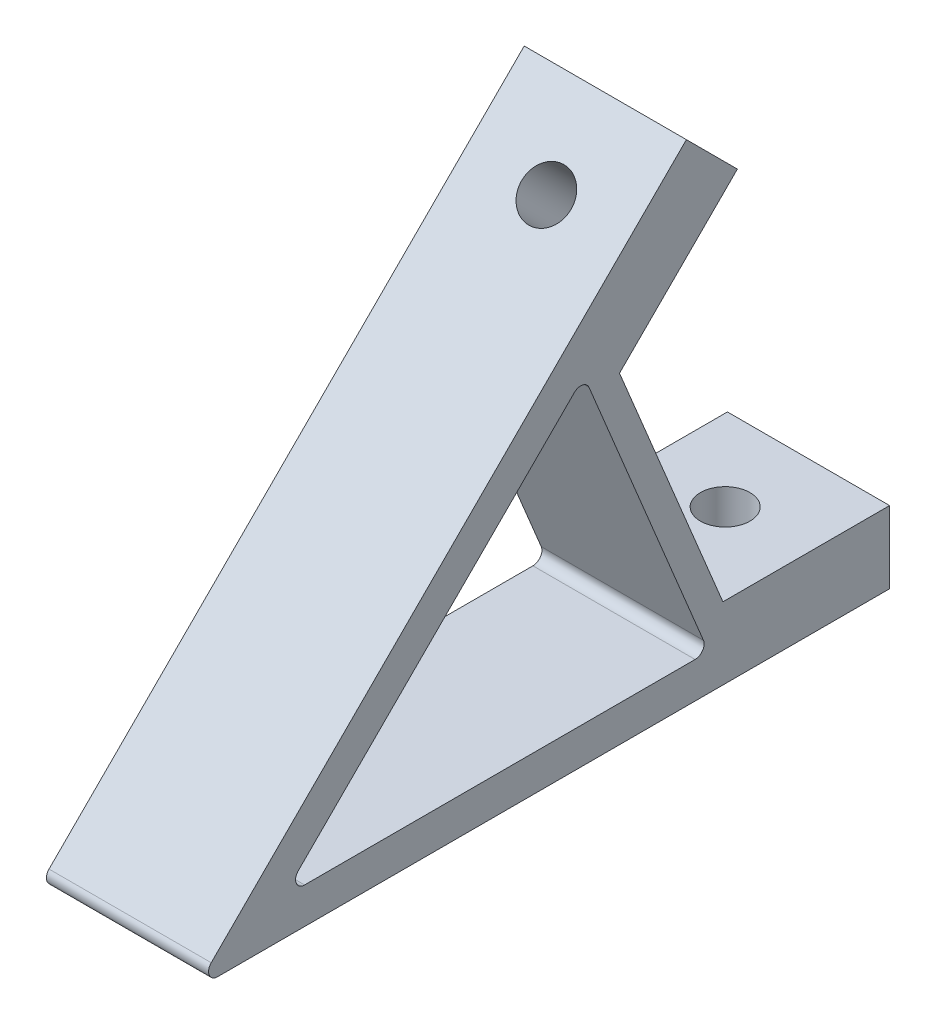
ISO-10303-21;
HEADER;
FILE_DESCRIPTION(('STEP AP214'),'2;1');
FILE_NAME('part.step','',(''),(''),'','','');
FILE_SCHEMA(('AUTOMOTIVE_DESIGN { 1 0 10303 214 1 1 1 1 }'));
ENDSEC;
DATA;
#1=APPLICATION_CONTEXT('core data for automotive mechanical design processes');
#2=APPLICATION_PROTOCOL_DEFINITION('international standard','automotive_design',2000,#1);
#3=PRODUCT_CONTEXT('',#1,'mechanical');
#4=PRODUCT('Part','Part','',(#3));
#5=PRODUCT_RELATED_PRODUCT_CATEGORY('part','',(#4));
#6=PRODUCT_DEFINITION_FORMATION('','',#4);
#7=PRODUCT_DEFINITION_CONTEXT('part definition',#1,'design');
#8=PRODUCT_DEFINITION('design','',#6,#7);
#9=PRODUCT_DEFINITION_SHAPE('','',#8);
#10=(LENGTH_UNIT() NAMED_UNIT(*) SI_UNIT(.MILLI.,.METRE.));
#11=(NAMED_UNIT(*) PLANE_ANGLE_UNIT() SI_UNIT($,.RADIAN.));
#12=(NAMED_UNIT(*) SI_UNIT($,.STERADIAN.) SOLID_ANGLE_UNIT());
#13=UNCERTAINTY_MEASURE_WITH_UNIT(LENGTH_MEASURE(1.E-05),#10,'distance_accuracy_value','');
#14=(GEOMETRIC_REPRESENTATION_CONTEXT(3) GLOBAL_UNCERTAINTY_ASSIGNED_CONTEXT((#13)) GLOBAL_UNIT_ASSIGNED_CONTEXT((#10,
#11,#12)) REPRESENTATION_CONTEXT('',''));
#15=CARTESIAN_POINT('',(0.,0.,0.));
#16=DIRECTION('',(0.,0.,1.));
#17=DIRECTION('',(1.,0.,0.));
#18=AXIS2_PLACEMENT_3D('',#15,#16,#17);
#19=CARTESIAN_POINT('',(18.,0.,0.));
#20=DIRECTION('',(-1.,0.,0.));
#21=DIRECTION('',(0.,0.,1.));
#22=AXIS2_PLACEMENT_3D('',#19,#20,#21);
#23=PLANE('',#22);
#24=DIRECTION('',(0.,-0.707106781186544,0.707106781186551));
#25=VECTOR('',#24,1.);
#26=CARTESIAN_POINT('',(18.,0.,0.));
#27=LINE('',#26,#25);
#28=CARTESIAN_POINT('',(18.,54.4472221513639,-54.4472221513644));
#29=VERTEX_POINT('',#28);
#30=CARTESIAN_POINT('',(18.,1.70710678118655,-1.70710678118657));
#31=VERTEX_POINT('',#30);
#32=EDGE_CURVE('E274',#29,#31,#27,.T.);
#33=ORIENTED_EDGE('',*,*,#32,.T.);
#34=CARTESIAN_POINT('',(18.,1.,-2.41421356237312));
#35=DIRECTION('',(-1.,0.,0.));
#36=DIRECTION('',(0.,0.,1.));
#37=AXIS2_PLACEMENT_3D('',#34,#35,#36);
#38=CIRCLE('',#37,1.);
#39=CARTESIAN_POINT('',(18.,0.,-2.41421356237312));
#40=VERTEX_POINT('',#39);
#41=EDGE_CURVE('E205',#31,#40,#38,.F.);
#42=ORIENTED_EDGE('',*,*,#41,.T.);
#43=DIRECTION('',(0.,0.,-1.));
#44=VECTOR('',#43,1.);
#45=CARTESIAN_POINT('',(18.,0.,-77.));
#46=LINE('',#45,#44);
#47=CARTESIAN_POINT('',(18.,0.,-77.));
#48=VERTEX_POINT('',#47);
#49=EDGE_CURVE('E159',#40,#48,#46,.T.);
#50=ORIENTED_EDGE('',*,*,#49,.T.);
#51=DIRECTION('',(0.,1.,0.));
#52=VECTOR('',#51,1.);
#53=CARTESIAN_POINT('',(18.,0.,-77.));
#54=LINE('',#53,#52);
#55=CARTESIAN_POINT('',(18.,7.99999999999972,-77.));
#56=VERTEX_POINT('',#55);
#57=EDGE_CURVE('E154',#48,#56,#54,.T.);
#58=ORIENTED_EDGE('',*,*,#57,.T.);
#59=DIRECTION('',(0.,0.,1.));
#60=VECTOR('',#59,1.);
#61=CARTESIAN_POINT('',(18.,7.99999999999904,-58.5));
#62=LINE('',#61,#60);
#63=CARTESIAN_POINT('',(18.,7.99999999999904,-58.5));
#64=VERTEX_POINT('',#63);
#65=EDGE_CURVE('E142',#56,#64,#62,.T.);
#66=ORIENTED_EDGE('',*,*,#65,.T.);
#67=DIRECTION('',(0.,0.923879532511292,0.382683432365077));
#68=VECTOR('',#67,1.);
#69=CARTESIAN_POINT('',(18.,35.7088924499204,-47.0226009489055));
#70=LINE('',#69,#68);
#71=CARTESIAN_POINT('',(18.,35.7088924499204,-47.0226009489055));
#72=VERTEX_POINT('',#71);
#73=EDGE_CURVE('E153',#64,#72,#70,.T.);
#74=ORIENTED_EDGE('',*,*,#73,.T.);
#75=DIRECTION('',(0.,0.707106781186544,-0.707106781186551));
#76=VECTOR('',#75,1.);
#77=CARTESIAN_POINT('',(18.,35.7088924499204,-47.0226009489055));
#78=LINE('',#77,#76);
#79=CARTESIAN_POINT('',(18.,48.7903679018715,-60.1040764008567));
#80=VERTEX_POINT('',#79);
#81=EDGE_CURVE('E268',#72,#80,#78,.T.);
#82=ORIENTED_EDGE('',*,*,#81,.T.);
#83=DIRECTION('',(0.,0.707106781186551,0.707106781186544));
#84=VECTOR('',#83,1.);
#85=CARTESIAN_POINT('',(18.,54.4472221513639,-54.4472221513644));
#86=LINE('',#85,#84);
#87=EDGE_CURVE('E271',#80,#29,#86,.T.);
#88=ORIENTED_EDGE('',*,*,#87,.T.);
#89=EDGE_LOOP('',(#33,#42,#50,#58,#66,#74,#82,#88));
#90=FACE_BOUND('',#89,.T.);
#91=DIRECTION('',(0.,-0.707106781186544,0.707106781186551));
#92=VECTOR('',#91,1.);
#93=CARTESIAN_POINT('',(18.,3.99999999999999,-9.65685424949244));
#94=LINE('',#93,#92);
#95=CARTESIAN_POINT('',(18.,36.3545317721863,-42.011386021679));
#96=VERTEX_POINT('',#95);
#97=CARTESIAN_POINT('',(18.,5.70710678118654,-11.363961030679));
#98=VERTEX_POINT('',#97);
#99=EDGE_CURVE('E243',#96,#98,#94,.T.);
#100=ORIENTED_EDGE('',*,*,#99,.F.);
#101=CARTESIAN_POINT('',(18.,35.6474249909997,-42.7184928028656));
#102=DIRECTION('',(-1.,0.,0.));
#103=DIRECTION('',(0.,0.,1.));
#104=AXIS2_PLACEMENT_3D('',#101,#102,#103);
#105=CIRCLE('',#104,1.);
#106=CARTESIAN_POINT('',(18.,36.0301084233648,-43.6423723353769));
#107=VERTEX_POINT('',#106);
#108=EDGE_CURVE('E217',#96,#107,#105,.T.);
#109=ORIENTED_EDGE('',*,*,#108,.T.);
#110=DIRECTION('',(0.,0.923879532511292,0.382683432365077));
#111=VECTOR('',#110,1.);
#112=CARTESIAN_POINT('',(18.,37.4127918557299,-43.0696461052227));
#113=LINE('',#112,#111);
#114=CARTESIAN_POINT('',(18.,5.38268343236506,-56.3369514184606));
#115=VERTEX_POINT('',#114);
#116=EDGE_CURVE('E253',#115,#107,#113,.T.);
#117=ORIENTED_EDGE('',*,*,#116,.F.);
#118=CARTESIAN_POINT('',(18.,4.99999999999999,-55.4130718859493));
#119=DIRECTION('',(-1.,0.,0.));
#120=DIRECTION('',(0.,0.,1.));
#121=AXIS2_PLACEMENT_3D('',#118,#119,#120);
#122=CIRCLE('',#121,1.);
#123=CARTESIAN_POINT('',(18.,3.99999999999999,-55.4130718859493));
#124=VERTEX_POINT('',#123);
#125=EDGE_CURVE('E211',#115,#124,#122,.T.);
#126=ORIENTED_EDGE('',*,*,#125,.T.);
#127=DIRECTION('',(0.,0.,-1.));
#128=VECTOR('',#127,1.);
#129=CARTESIAN_POINT('',(18.,3.99999999999999,-9.65685424949244));
#130=LINE('',#129,#128);
#131=CARTESIAN_POINT('',(18.,3.99999999999999,-12.0710678118656));
#132=VERTEX_POINT('',#131);
#133=EDGE_CURVE('E245',#132,#124,#130,.T.);
#134=ORIENTED_EDGE('',*,*,#133,.F.);
#135=CARTESIAN_POINT('',(18.,4.99999999999999,-12.0710678118656));
#136=DIRECTION('',(-1.,0.,0.));
#137=DIRECTION('',(0.,0.,1.));
#138=AXIS2_PLACEMENT_3D('',#135,#136,#137);
#139=CIRCLE('',#138,1.);
#140=EDGE_CURVE('E11',#132,#98,#139,.T.);
#141=ORIENTED_EDGE('',*,*,#140,.T.);
#142=EDGE_LOOP('',(#100,#109,#117,#126,#134,#141));
#143=FACE_BOUND('',#142,.T.);
#144=ADVANCED_FACE('F39',(#90,#143),#23,.F.);
#145=CARTESIAN_POINT('',(0.,0.,0.));
#146=DIRECTION('',(-1.,0.,0.));
#147=DIRECTION('',(0.,0.,1.));
#148=AXIS2_PLACEMENT_3D('',#145,#146,#147);
#149=PLANE('',#148);
#150=DIRECTION('',(0.,0.,-1.));
#151=VECTOR('',#150,1.);
#152=CARTESIAN_POINT('',(0.,0.,-77.));
#153=LINE('',#152,#151);
#154=CARTESIAN_POINT('',(0.,0.,-2.41421356237312));
#155=VERTEX_POINT('',#154);
#156=CARTESIAN_POINT('',(0.,0.,-77.));
#157=VERTEX_POINT('',#156);
#158=EDGE_CURVE('E164',#155,#157,#153,.T.);
#159=ORIENTED_EDGE('',*,*,#158,.F.);
#160=CARTESIAN_POINT('',(0.,1.,-2.41421356237312));
#161=DIRECTION('',(-1.,0.,0.));
#162=DIRECTION('',(0.,0.,1.));
#163=AXIS2_PLACEMENT_3D('',#160,#161,#162);
#164=CIRCLE('',#163,1.);
#165=CARTESIAN_POINT('',(0.,1.70710678118655,-1.70710678118657));
#166=VERTEX_POINT('',#165);
#167=EDGE_CURVE('E63',#155,#166,#164,.T.);
#168=ORIENTED_EDGE('',*,*,#167,.T.);
#169=DIRECTION('',(0.,-0.707106781186544,0.707106781186551));
#170=VECTOR('',#169,1.);
#171=CARTESIAN_POINT('',(0.,0.,0.));
#172=LINE('',#171,#170);
#173=CARTESIAN_POINT('',(0.,54.4472221513639,-54.4472221513644));
#174=VERTEX_POINT('',#173);
#175=EDGE_CURVE('E294',#174,#166,#172,.T.);
#176=ORIENTED_EDGE('',*,*,#175,.F.);
#177=DIRECTION('',(0.,0.707106781186551,0.707106781186544));
#178=VECTOR('',#177,1.);
#179=CARTESIAN_POINT('',(0.,54.4472221513639,-54.4472221513644));
#180=LINE('',#179,#178);
#181=CARTESIAN_POINT('',(0.,48.7903679018715,-60.1040764008567));
#182=VERTEX_POINT('',#181);
#183=EDGE_CURVE('E291',#182,#174,#180,.T.);
#184=ORIENTED_EDGE('',*,*,#183,.F.);
#185=DIRECTION('',(0.,0.707106781186544,-0.707106781186551));
#186=VECTOR('',#185,1.);
#187=CARTESIAN_POINT('',(0.,35.7088924499204,-47.0226009489055));
#188=LINE('',#187,#186);
#189=CARTESIAN_POINT('',(0.,35.7088924499204,-47.0226009489055));
#190=VERTEX_POINT('',#189);
#191=EDGE_CURVE('E288',#190,#182,#188,.T.);
#192=ORIENTED_EDGE('',*,*,#191,.F.);
#193=DIRECTION('',(0.,0.923879532511292,0.382683432365077));
#194=VECTOR('',#193,1.);
#195=CARTESIAN_POINT('',(0.,35.7088924499204,-47.0226009489055));
#196=LINE('',#195,#194);
#197=CARTESIAN_POINT('',(0.,7.99999999999904,-58.5));
#198=VERTEX_POINT('',#197);
#199=EDGE_CURVE('E285',#198,#190,#196,.T.);
#200=ORIENTED_EDGE('',*,*,#199,.F.);
#201=DIRECTION('',(0.,0.,1.));
#202=VECTOR('',#201,1.);
#203=CARTESIAN_POINT('',(0.,7.99999999999904,-58.5));
#204=LINE('',#203,#202);
#205=CARTESIAN_POINT('',(0.,7.99999999999972,-77.));
#206=VERTEX_POINT('',#205);
#207=EDGE_CURVE('E282',#206,#198,#204,.T.);
#208=ORIENTED_EDGE('',*,*,#207,.F.);
#209=DIRECTION('',(0.,1.,0.));
#210=VECTOR('',#209,1.);
#211=CARTESIAN_POINT('',(0.,0.,-77.));
#212=LINE('',#211,#210);
#213=EDGE_CURVE('E168',#157,#206,#212,.T.);
#214=ORIENTED_EDGE('',*,*,#213,.F.);
#215=EDGE_LOOP('',(#159,#168,#176,#184,#192,#200,#208,#214));
#216=FACE_BOUND('',#215,.T.);
#217=DIRECTION('',(0.,0.,-1.));
#218=VECTOR('',#217,1.);
#219=CARTESIAN_POINT('',(0.,3.99999999999999,-9.65685424949244));
#220=LINE('',#219,#218);
#221=CARTESIAN_POINT('',(0.,3.99999999999999,-12.0710678118656));
#222=VERTEX_POINT('',#221);
#223=CARTESIAN_POINT('',(0.,3.99999999999999,-55.4130718859493));
#224=VERTEX_POINT('',#223);
#225=EDGE_CURVE('E225',#222,#224,#220,.T.);
#226=ORIENTED_EDGE('',*,*,#225,.T.);
#227=CARTESIAN_POINT('',(0.,4.99999999999999,-55.4130718859493));
#228=DIRECTION('',(-1.,0.,0.));
#229=DIRECTION('',(0.,0.,1.));
#230=AXIS2_PLACEMENT_3D('',#227,#228,#229);
#231=CIRCLE('',#230,1.);
#232=CARTESIAN_POINT('',(0.,5.38268343236506,-56.3369514184606));
#233=VERTEX_POINT('',#232);
#234=EDGE_CURVE('E208',#224,#233,#231,.F.);
#235=ORIENTED_EDGE('',*,*,#234,.T.);
#236=DIRECTION('',(0.,0.923879532511292,0.382683432365077));
#237=VECTOR('',#236,1.);
#238=CARTESIAN_POINT('',(0.,37.4127918557299,-43.0696461052227));
#239=LINE('',#238,#237);
#240=CARTESIAN_POINT('',(0.,36.0301084233648,-43.6423723353769));
#241=VERTEX_POINT('',#240);
#242=EDGE_CURVE('E237',#233,#241,#239,.T.);
#243=ORIENTED_EDGE('',*,*,#242,.T.);
#244=CARTESIAN_POINT('',(0.,35.6474249909997,-42.7184928028656));
#245=DIRECTION('',(-1.,0.,0.));
#246=DIRECTION('',(0.,0.,1.));
#247=AXIS2_PLACEMENT_3D('',#244,#245,#246);
#248=CIRCLE('',#247,1.);
#249=CARTESIAN_POINT('',(0.,36.3545317721863,-42.011386021679));
#250=VERTEX_POINT('',#249);
#251=EDGE_CURVE('E214',#241,#250,#248,.F.);
#252=ORIENTED_EDGE('',*,*,#251,.T.);
#253=DIRECTION('',(0.,-0.707106781186544,0.707106781186551));
#254=VECTOR('',#253,1.);
#255=CARTESIAN_POINT('',(0.,3.99999999999999,-9.65685424949244));
#256=LINE('',#255,#254);
#257=CARTESIAN_POINT('',(0.,5.70710678118654,-11.363961030679));
#258=VERTEX_POINT('',#257);
#259=EDGE_CURVE('E227',#250,#258,#256,.T.);
#260=ORIENTED_EDGE('',*,*,#259,.T.);
#261=CARTESIAN_POINT('',(0.,4.99999999999999,-12.0710678118656));
#262=DIRECTION('',(-1.,0.,0.));
#263=DIRECTION('',(0.,0.,1.));
#264=AXIS2_PLACEMENT_3D('',#261,#262,#263);
#265=CIRCLE('',#264,1.);
#266=EDGE_CURVE('E48',#258,#222,#265,.F.);
#267=ORIENTED_EDGE('',*,*,#266,.T.);
#268=EDGE_LOOP('',(#226,#235,#243,#252,#260,#267));
#269=FACE_BOUND('',#268,.T.);
#270=ADVANCED_FACE('F224',(#216,#269),#149,.T.);
#271=CARTESIAN_POINT('',(18.,0.,-77.));
#272=DIRECTION('',(0.,0.,1.));
#273=DIRECTION('',(1.,0.,0.));
#274=AXIS2_PLACEMENT_3D('',#271,#272,#273);
#275=PLANE('',#274);
#276=ORIENTED_EDGE('',*,*,#213,.T.);
#277=DIRECTION('',(-1.,0.,0.));
#278=VECTOR('',#277,1.);
#279=CARTESIAN_POINT('',(18.,7.99999999999972,-77.));
#280=LINE('',#279,#278);
#281=EDGE_CURVE('E146',#56,#206,#280,.T.);
#282=ORIENTED_EDGE('',*,*,#281,.F.);
#283=ORIENTED_EDGE('',*,*,#57,.F.);
#284=DIRECTION('',(-1.,0.,0.));
#285=VECTOR('',#284,1.);
#286=CARTESIAN_POINT('',(18.,0.,-77.));
#287=LINE('',#286,#285);
#288=EDGE_CURVE('E279',#48,#157,#287,.T.);
#289=ORIENTED_EDGE('',*,*,#288,.T.);
#290=EDGE_LOOP('',(#276,#282,#283,#289));
#291=FACE_BOUND('',#290,.T.);
#292=ADVANCED_FACE('F166',(#291),#275,.F.);
#293=CARTESIAN_POINT('',(18.,7.99999999999904,-58.5));
#294=DIRECTION('',(0.,-1.,0.));
#295=DIRECTION('',(0.,0.,-1.));
#296=AXIS2_PLACEMENT_3D('',#293,#294,#295);
#297=PLANE('',#296);
#298=CARTESIAN_POINT('',(9.,7.99999999999938,-67.75));
#299=DIRECTION('',(0.,1.,0.));
#300=DIRECTION('',(0.,0.,1.));
#301=AXIS2_PLACEMENT_3D('',#298,#299,#300);
#302=CIRCLE('',#301,2.75);
#303=CARTESIAN_POINT('',(9.,7.99999999999928,-65.));
#304=VERTEX_POINT('',#303);
#305=EDGE_CURVE('E494',#304,#304,#302,.T.);
#306=ORIENTED_EDGE('',*,*,#305,.F.);
#307=EDGE_LOOP('',(#306));
#308=FACE_BOUND('',#307,.T.);
#309=ORIENTED_EDGE('',*,*,#207,.T.);
#310=DIRECTION('',(-1.,0.,0.));
#311=VECTOR('',#310,1.);
#312=CARTESIAN_POINT('',(18.,7.99999999999904,-58.5));
#313=LINE('',#312,#311);
#314=EDGE_CURVE('E149',#64,#198,#313,.T.);
#315=ORIENTED_EDGE('',*,*,#314,.F.);
#316=ORIENTED_EDGE('',*,*,#65,.F.);
#317=ORIENTED_EDGE('',*,*,#281,.T.);
#318=EDGE_LOOP('',(#309,#315,#316,#317));
#319=FACE_BOUND('',#318,.T.);
#320=ADVANCED_FACE('F144',(#308,#319),#297,.F.);
#321=CARTESIAN_POINT('',(18.,35.7088924499204,-47.0226009489055));
#322=DIRECTION('',(0.,-0.382683432365077,0.923879532511292));
#323=DIRECTION('',(0.,-0.923879532511292,-0.382683432365077));
#324=AXIS2_PLACEMENT_3D('',#321,#322,#323);
#325=PLANE('',#324);
#326=ORIENTED_EDGE('',*,*,#199,.T.);
#327=DIRECTION('',(-1.,0.,0.));
#328=VECTOR('',#327,1.);
#329=CARTESIAN_POINT('',(18.,35.7088924499204,-47.0226009489055));
#330=LINE('',#329,#328);
#331=EDGE_CURVE('E176',#72,#190,#330,.T.);
#332=ORIENTED_EDGE('',*,*,#331,.F.);
#333=ORIENTED_EDGE('',*,*,#73,.F.);
#334=ORIENTED_EDGE('',*,*,#314,.T.);
#335=EDGE_LOOP('',(#326,#332,#333,#334));
#336=FACE_BOUND('',#335,.T.);
#337=ADVANCED_FACE('F329',(#336),#325,.F.);
#338=CARTESIAN_POINT('',(18.,35.7088924499204,-47.0226009489055));
#339=DIRECTION('',(0.,0.707106781186551,0.707106781186544));
#340=DIRECTION('',(0.,-0.707106781186544,0.707106781186551));
#341=AXIS2_PLACEMENT_3D('',#338,#339,#340);
#342=PLANE('',#341);
#343=CARTESIAN_POINT('',(9.,42.249630175896,-53.5633386748811));
#344=DIRECTION('',(0.,-0.707106781186551,-0.707106781186544));
#345=DIRECTION('',(0.,0.707106781186544,-0.707106781186551));
#346=AXIS2_PLACEMENT_3D('',#343,#344,#345);
#347=CIRCLE('',#346,2.75);
#348=CARTESIAN_POINT('',(9.,44.194173824159,-55.5078823231442));
#349=VERTEX_POINT('',#348);
#350=EDGE_CURVE('E489',#349,#349,#347,.T.);
#351=ORIENTED_EDGE('',*,*,#350,.F.);
#352=EDGE_LOOP('',(#351));
#353=FACE_BOUND('',#352,.T.);
#354=ORIENTED_EDGE('',*,*,#191,.T.);
#355=DIRECTION('',(-1.,0.,0.));
#356=VECTOR('',#355,1.);
#357=CARTESIAN_POINT('',(18.,48.7903679018715,-60.1040764008567));
#358=LINE('',#357,#356);
#359=EDGE_CURVE('E305',#80,#182,#358,.T.);
#360=ORIENTED_EDGE('',*,*,#359,.F.);
#361=ORIENTED_EDGE('',*,*,#81,.F.);
#362=ORIENTED_EDGE('',*,*,#331,.T.);
#363=EDGE_LOOP('',(#354,#360,#361,#362));
#364=FACE_BOUND('',#363,.T.);
#365=ADVANCED_FACE('F314',(#353,#364),#342,.F.);
#366=CARTESIAN_POINT('',(18.,54.4472221513639,-54.4472221513644));
#367=DIRECTION('',(0.,-0.707106781186544,0.707106781186551));
#368=DIRECTION('',(0.,-0.707106781186551,-0.707106781186544));
#369=AXIS2_PLACEMENT_3D('',#366,#367,#368);
#370=PLANE('',#369);
#371=ORIENTED_EDGE('',*,*,#183,.T.);
#372=DIRECTION('',(-1.,0.,0.));
#373=VECTOR('',#372,1.);
#374=CARTESIAN_POINT('',(18.,54.4472221513639,-54.4472221513644));
#375=LINE('',#374,#373);
#376=EDGE_CURVE('E301',#29,#174,#375,.T.);
#377=ORIENTED_EDGE('',*,*,#376,.F.);
#378=ORIENTED_EDGE('',*,*,#87,.F.);
#379=ORIENTED_EDGE('',*,*,#359,.T.);
#380=EDGE_LOOP('',(#371,#377,#378,#379));
#381=FACE_BOUND('',#380,.T.);
#382=ADVANCED_FACE('F321',(#381),#370,.F.);
#383=CARTESIAN_POINT('',(18.,0.,0.));
#384=DIRECTION('',(0.,-0.707106781186551,-0.707106781186544));
#385=DIRECTION('',(0.,0.707106781186544,-0.707106781186551));
#386=AXIS2_PLACEMENT_3D('',#383,#384,#385);
#387=PLANE('',#386);
#388=CARTESIAN_POINT('',(9.,47.9064844253883,-47.9064844253888));
#389=DIRECTION('',(0.,-0.707106781186551,-0.707106781186544));
#390=DIRECTION('',(0.,0.707106781186544,-0.707106781186551));
#391=AXIS2_PLACEMENT_3D('',#388,#389,#390);
#392=CIRCLE('',#391,2.75);
#393=CARTESIAN_POINT('',(9.,49.8510280736513,-49.8510280736519));
#394=VERTEX_POINT('',#393);
#395=EDGE_CURVE('E492',#394,#394,#392,.F.);
#396=ORIENTED_EDGE('',*,*,#395,.F.);
#397=EDGE_LOOP('',(#396));
#398=FACE_BOUND('',#397,.T.);
#399=ORIENTED_EDGE('',*,*,#175,.T.);
#400=DIRECTION('',(-1.,0.,0.));
#401=VECTOR('',#400,1.);
#402=CARTESIAN_POINT('',(18.,1.70710678118655,-1.70710678118657));
#403=LINE('',#402,#401);
#404=EDGE_CURVE('E55',#166,#31,#403,.F.);
#405=ORIENTED_EDGE('',*,*,#404,.T.);
#406=ORIENTED_EDGE('',*,*,#32,.F.);
#407=ORIENTED_EDGE('',*,*,#376,.T.);
#408=EDGE_LOOP('',(#399,#405,#406,#407));
#409=FACE_BOUND('',#408,.T.);
#410=ADVANCED_FACE('F323',(#398,#409),#387,.F.);
#411=CARTESIAN_POINT('',(18.,0.,-77.));
#412=DIRECTION('',(0.,1.,0.));
#413=DIRECTION('',(0.,0.,1.));
#414=AXIS2_PLACEMENT_3D('',#411,#412,#413);
#415=PLANE('',#414);
#416=CARTESIAN_POINT('',(9.,0.,-67.7500000000003));
#417=DIRECTION('',(0.,1.,0.));
#418=DIRECTION('',(0.,0.,1.));
#419=AXIS2_PLACEMENT_3D('',#416,#417,#418);
#420=CIRCLE('',#419,2.75);
#421=CARTESIAN_POINT('',(9.,0.,-65.0000000000003));
#422=VERTEX_POINT('',#421);
#423=EDGE_CURVE('E258',#422,#422,#420,.F.);
#424=ORIENTED_EDGE('',*,*,#423,.F.);
#425=EDGE_LOOP('',(#424));
#426=FACE_BOUND('',#425,.T.);
#427=ORIENTED_EDGE('',*,*,#49,.F.);
#428=DIRECTION('',(-1.,0.,0.));
#429=VECTOR('',#428,1.);
#430=CARTESIAN_POINT('',(18.,0.,-2.41421356237312));
#431=LINE('',#430,#429);
#432=EDGE_CURVE('E197',#40,#155,#431,.T.);
#433=ORIENTED_EDGE('',*,*,#432,.T.);
#434=ORIENTED_EDGE('',*,*,#158,.T.);
#435=ORIENTED_EDGE('',*,*,#288,.F.);
#436=EDGE_LOOP('',(#427,#433,#434,#435));
#437=FACE_BOUND('',#436,.T.);
#438=ADVANCED_FACE('F328',(#426,#437),#415,.F.);
#439=CARTESIAN_POINT('',(18.,3.99999999999999,-9.65685424949244));
#440=DIRECTION('',(0.,-0.707106781186551,-0.707106781186544));
#441=DIRECTION('',(0.,0.707106781186544,-0.707106781186551));
#442=AXIS2_PLACEMENT_3D('',#439,#440,#441);
#443=PLANE('',#442);
#444=ORIENTED_EDGE('',*,*,#259,.F.);
#445=DIRECTION('',(-1.,0.,0.));
#446=VECTOR('',#445,1.);
#447=CARTESIAN_POINT('',(18.,36.3545317721862,-42.011386021679));
#448=LINE('',#447,#446);
#449=EDGE_CURVE('E194',#250,#96,#448,.F.);
#450=ORIENTED_EDGE('',*,*,#449,.T.);
#451=ORIENTED_EDGE('',*,*,#99,.T.);
#452=DIRECTION('',(-1.,0.,0.));
#453=VECTOR('',#452,1.);
#454=CARTESIAN_POINT('',(0.,5.70710678118654,-11.363961030679));
#455=LINE('',#454,#453);
#456=EDGE_CURVE('E190',#98,#258,#455,.T.);
#457=ORIENTED_EDGE('',*,*,#456,.T.);
#458=EDGE_LOOP('',(#444,#450,#451,#457));
#459=FACE_BOUND('',#458,.T.);
#460=ADVANCED_FACE('F247',(#459),#443,.T.);
#461=CARTESIAN_POINT('',(18.,3.99999999999999,-9.65685424949244));
#462=DIRECTION('',(0.,1.,0.));
#463=DIRECTION('',(0.,0.,1.));
#464=AXIS2_PLACEMENT_3D('',#461,#462,#463);
#465=PLANE('',#464);
#466=ORIENTED_EDGE('',*,*,#133,.T.);
#467=DIRECTION('',(-1.,0.,0.));
#468=VECTOR('',#467,1.);
#469=CARTESIAN_POINT('',(0.,3.99999999999999,-55.4130718859493));
#470=LINE('',#469,#468);
#471=EDGE_CURVE('E174',#124,#224,#470,.T.);
#472=ORIENTED_EDGE('',*,*,#471,.T.);
#473=ORIENTED_EDGE('',*,*,#225,.F.);
#474=DIRECTION('',(-1.,0.,0.));
#475=VECTOR('',#474,1.);
#476=CARTESIAN_POINT('',(18.,3.99999999999999,-12.0710678118656));
#477=LINE('',#476,#475);
#478=EDGE_CURVE('E170',#222,#132,#477,.F.);
#479=ORIENTED_EDGE('',*,*,#478,.T.);
#480=EDGE_LOOP('',(#466,#472,#473,#479));
#481=FACE_BOUND('',#480,.T.);
#482=ADVANCED_FACE('F233',(#481),#465,.T.);
#483=CARTESIAN_POINT('',(18.,37.4127918557299,-43.0696461052227));
#484=DIRECTION('',(0.,-0.382683432365077,0.923879532511292));
#485=DIRECTION('',(0.,-0.923879532511292,-0.382683432365077));
#486=AXIS2_PLACEMENT_3D('',#483,#484,#485);
#487=PLANE('',#486);
#488=ORIENTED_EDGE('',*,*,#242,.F.);
#489=DIRECTION('',(-1.,0.,0.));
#490=VECTOR('',#489,1.);
#491=CARTESIAN_POINT('',(18.,5.38268343236507,-56.3369514184606));
#492=LINE('',#491,#490);
#493=EDGE_CURVE('E187',#233,#115,#492,.F.);
#494=ORIENTED_EDGE('',*,*,#493,.T.);
#495=ORIENTED_EDGE('',*,*,#116,.T.);
#496=DIRECTION('',(-1.,0.,0.));
#497=VECTOR('',#496,1.);
#498=CARTESIAN_POINT('',(0.,36.0301084233648,-43.6423723353769));
#499=LINE('',#498,#497);
#500=EDGE_CURVE('E183',#107,#241,#499,.T.);
#501=ORIENTED_EDGE('',*,*,#500,.T.);
#502=EDGE_LOOP('',(#488,#494,#495,#501));
#503=FACE_BOUND('',#502,.T.);
#504=ADVANCED_FACE('F383',(#503),#487,.T.);
#505=CARTESIAN_POINT('',(18.,4.99999999999999,-55.4130718859493));
#506=DIRECTION('',(1.,0.,0.));
#507=DIRECTION('',(0.,0.,-1.));
#508=AXIS2_PLACEMENT_3D('',#505,#506,#507);
#509=CYLINDRICAL_SURFACE('',#508,1.);
#510=ORIENTED_EDGE('',*,*,#125,.F.);
#511=ORIENTED_EDGE('',*,*,#493,.F.);
#512=ORIENTED_EDGE('',*,*,#234,.F.);
#513=ORIENTED_EDGE('',*,*,#471,.F.);
#514=EDGE_LOOP('',(#510,#511,#512,#513));
#515=FACE_BOUND('',#514,.T.);
#516=ADVANCED_FACE('F389',(#515),#509,.F.);
#517=CARTESIAN_POINT('',(18.,35.6474249909997,-42.7184928028656));
#518=DIRECTION('',(1.,0.,0.));
#519=DIRECTION('',(0.,0.,-1.));
#520=AXIS2_PLACEMENT_3D('',#517,#518,#519);
#521=CYLINDRICAL_SURFACE('',#520,1.);
#522=ORIENTED_EDGE('',*,*,#108,.F.);
#523=ORIENTED_EDGE('',*,*,#449,.F.);
#524=ORIENTED_EDGE('',*,*,#251,.F.);
#525=ORIENTED_EDGE('',*,*,#500,.F.);
#526=EDGE_LOOP('',(#522,#523,#524,#525));
#527=FACE_BOUND('',#526,.T.);
#528=ADVANCED_FACE('F397',(#527),#521,.F.);
#529=CARTESIAN_POINT('',(18.,4.99999999999999,-12.0710678118656));
#530=DIRECTION('',(1.,0.,0.));
#531=DIRECTION('',(0.,0.,-1.));
#532=AXIS2_PLACEMENT_3D('',#529,#530,#531);
#533=CYLINDRICAL_SURFACE('',#532,1.);
#534=ORIENTED_EDGE('',*,*,#140,.F.);
#535=ORIENTED_EDGE('',*,*,#478,.F.);
#536=ORIENTED_EDGE('',*,*,#266,.F.);
#537=ORIENTED_EDGE('',*,*,#456,.F.);
#538=EDGE_LOOP('',(#534,#535,#536,#537));
#539=FACE_BOUND('',#538,.T.);
#540=ADVANCED_FACE('F240',(#539),#533,.F.);
#541=CARTESIAN_POINT('',(18.,1.,-2.41421356237312));
#542=DIRECTION('',(-1.,0.,0.));
#543=DIRECTION('',(0.,0.,1.));
#544=AXIS2_PLACEMENT_3D('',#541,#542,#543);
#545=CYLINDRICAL_SURFACE('',#544,1.);
#546=ORIENTED_EDGE('',*,*,#41,.F.);
#547=ORIENTED_EDGE('',*,*,#404,.F.);
#548=ORIENTED_EDGE('',*,*,#167,.F.);
#549=ORIENTED_EDGE('',*,*,#432,.F.);
#550=EDGE_LOOP('',(#546,#547,#548,#549));
#551=FACE_BOUND('',#550,.T.);
#552=ADVANCED_FACE('F41',(#551),#545,.T.);
#553=CARTESIAN_POINT('',(9.,-0.00100000000033927,-67.7500000000003));
#554=DIRECTION('',(0.,1.,0.));
#555=DIRECTION('',(0.,0.,1.));
#556=AXIS2_PLACEMENT_3D('',#553,#554,#555);
#557=CYLINDRICAL_SURFACE('',#556,2.75);
#558=ORIENTED_EDGE('',*,*,#305,.T.);
#559=EDGE_LOOP('',(#558));
#560=FACE_BOUND('',#559,.T.);
#561=ORIENTED_EDGE('',*,*,#423,.T.);
#562=EDGE_LOOP('',(#561));
#563=FACE_BOUND('',#562,.T.);
#564=ADVANCED_FACE('F417',(#560,#563),#557,.F.);
#565=CARTESIAN_POINT('',(9.,74.423988719884,-21.3889801308934));
#566=DIRECTION('',(0.,-0.707106781186551,-0.707106781186544));
#567=DIRECTION('',(0.,0.707106781186544,-0.707106781186551));
#568=AXIS2_PLACEMENT_3D('',#565,#566,#567);
#569=CYLINDRICAL_SURFACE('',#568,2.75);
#570=CARTESIAN_POINT('',(9.,44.194173824159,-55.5078823231442));
#571=CARTESIAN_POINT('',(9.,44.2530993892579,-55.4489567580453));
#572=CARTESIAN_POINT('',(9.,44.3120249543567,-55.3900311929464));
#573=CARTESIAN_POINT('',(9.,44.4298760845545,-55.2721800627486));
#574=CARTESIAN_POINT('',(9.,44.4888016496534,-55.2132544976498));
#575=CARTESIAN_POINT('',(9.,44.6066527798511,-55.095403367452));
#576=CARTESIAN_POINT('',(9.,44.66557834495,-55.0364778023531));
#577=CARTESIAN_POINT('',(9.,44.7834294751478,-54.9186266721554));
#578=CARTESIAN_POINT('',(9.,44.8423550402466,-54.8597011070565));
#579=CARTESIAN_POINT('',(9.,44.9602061704444,-54.7418499768587));
#580=CARTESIAN_POINT('',(9.,45.0191317355433,-54.6829244117599));
#581=CARTESIAN_POINT('',(9.,45.136982865741,-54.5650732815621));
#582=CARTESIAN_POINT('',(9.,45.1959084308399,-54.5061477164632));
#583=CARTESIAN_POINT('',(9.,45.3137595610377,-54.3882965862655));
#584=CARTESIAN_POINT('',(9.,45.3726851261365,-54.3293710211666));
#585=CARTESIAN_POINT('',(9.,45.4905362563343,-54.2115198909688));
#586=CARTESIAN_POINT('',(9.,45.5494618214332,-54.15259432587));
#587=CARTESIAN_POINT('',(9.,45.6673129516309,-54.0347431956722));
#588=CARTESIAN_POINT('',(9.,45.7262385167298,-53.9758176305733));
#589=CARTESIAN_POINT('',(9.,45.8440896469276,-53.8579665003756));
#590=CARTESIAN_POINT('',(9.,45.9030152120265,-53.7990409352767));
#591=CARTESIAN_POINT('',(9.,46.0208663422242,-53.6811898050789));
#592=CARTESIAN_POINT('',(9.,46.0797919073231,-53.6222642399801));
#593=CARTESIAN_POINT('',(9.,46.1976430375208,-53.5044131097823));
#594=CARTESIAN_POINT('',(9.,46.2565686026197,-53.4454875446834));
#595=CARTESIAN_POINT('',(9.,46.3744197328175,-53.3276364144857));
#596=CARTESIAN_POINT('',(9.,46.4333452979164,-53.2687108493868));
#597=CARTESIAN_POINT('',(9.,46.5511964281141,-53.150859719189));
#598=CARTESIAN_POINT('',(9.,46.610121993213,-53.0919341540901));
#599=CARTESIAN_POINT('',(9.,46.7279731234108,-52.9740830238924));
#600=CARTESIAN_POINT('',(9.,46.7868986885096,-52.9151574587935));
#601=CARTESIAN_POINT('',(9.,46.9047498187074,-52.7973063285958));
#602=CARTESIAN_POINT('',(9.,46.9636753838063,-52.7383807634969));
#603=CARTESIAN_POINT('',(9.,47.081526514004,-52.6205296332991));
#604=CARTESIAN_POINT('',(9.,47.1404520791029,-52.5616040682002));
#605=CARTESIAN_POINT('',(9.,47.2583032093007,-52.4437529380025));
#606=CARTESIAN_POINT('',(9.,47.3172287743995,-52.3848273729036));
#607=CARTESIAN_POINT('',(9.,47.4350799045973,-52.2669762427059));
#608=CARTESIAN_POINT('',(9.,47.4940054696962,-52.208050677607));
#609=CARTESIAN_POINT('',(9.,47.6118565998939,-52.0901995474092));
#610=CARTESIAN_POINT('',(9.,47.6707821649928,-52.0312739823103));
#611=CARTESIAN_POINT('',(9.,47.7886332951906,-51.9134228521126));
#612=CARTESIAN_POINT('',(9.,47.8475588602895,-51.8544972870137));
#613=CARTESIAN_POINT('',(9.,47.9654099904872,-51.736646156816));
#614=CARTESIAN_POINT('',(9.,48.0243355555861,-51.6777205917171));
#615=CARTESIAN_POINT('',(9.,48.1421866857838,-51.5598694615193));
#616=CARTESIAN_POINT('',(9.,48.2011122508827,-51.5009438964204));
#617=CARTESIAN_POINT('',(9.,48.3189633810805,-51.3830927662227));
#618=CARTESIAN_POINT('',(9.,48.3778889461794,-51.3241672011238));
#619=CARTESIAN_POINT('',(9.,48.4957400763771,-51.2063160709261));
#620=CARTESIAN_POINT('',(9.,48.554665641476,-51.1473905058272));
#621=CARTESIAN_POINT('',(9.,48.6725167716738,-51.0295393756294));
#622=CARTESIAN_POINT('',(9.,48.7314423367726,-50.9706138105305));
#623=CARTESIAN_POINT('',(9.,48.8492934669704,-50.8527626803328));
#624=CARTESIAN_POINT('',(9.,48.9082190320693,-50.7938371152339));
#625=CARTESIAN_POINT('',(9.,49.026070162267,-50.6759859850361));
#626=CARTESIAN_POINT('',(9.,49.0849957273659,-50.6170604199373));
#627=CARTESIAN_POINT('',(9.,49.2028468575637,-50.4992092897395));
#628=CARTESIAN_POINT('',(9.,49.2617724226625,-50.4402837246406));
#629=CARTESIAN_POINT('',(9.,49.3796235528603,-50.3224325944429));
#630=CARTESIAN_POINT('',(9.,49.4385491179592,-50.263507029344));
#631=CARTESIAN_POINT('',(9.,49.5564002481569,-50.1456558991462));
#632=CARTESIAN_POINT('',(9.,49.6153258132558,-50.0867303340474));
#633=CARTESIAN_POINT('',(9.,49.7331769434536,-49.9688792038496));
#634=CARTESIAN_POINT('',(9.,49.7921025085524,-49.9099536387507));
#635=CARTESIAN_POINT('',(9.,49.8510280736513,-49.8510280736519));
#636=B_SPLINE_CURVE_WITH_KNOTS('',3,(#570,#571,#572,#573,#574,#575,#576,#577,#578,#579,#580,
#581,#582,#583,#584,#585,#586,#587,#588,#589,#590,#591,#592,#593,#594,#595,#596,#597,#598,#599,
#600,#601,#602,#603,#604,#605,#606,#607,#608,#609,#610,#611,#612,#613,#614,#615,#616,#617,#618,
#619,#620,#621,#622,#623,#624,#625,#626,#627,#628,#629,#630,#631,#632,#633,#634,#635),
.UNSPECIFIED.,.F.,.F.,(4,2,2,2,2,2,2,2,2,2,2,2,2,2,2,2,2,2,2,2,2,2,2,2,2,2,2,2,2,2,2,2,4),(0.,
0.250000000000009,0.499999999999998,0.750000000000002,0.999999999999997,1.24999999999999,1.5,
1.74999999999999,1.99999999999998,2.24999999999999,2.49999999999998,2.74999999999998,
2.99999999999998,3.24999999999997,3.49999999999998,3.74999999999997,3.99999999999997,
4.24999999999997,4.49999999999996,4.74999999999996,4.99999999999995,5.24999999999996,
5.49999999999996,5.74999999999995,5.99999999999994,6.24999999999995,6.49999999999994,
6.74999999999994,6.99999999999994,7.24999999999994,7.49999999999993,7.74999999999993,
7.99999999999993),.UNSPECIFIED.);
#637=EDGE_CURVE('BSEAM422',#349,#394,#636,.T.);
#638=ORIENTED_EDGE('',*,*,#350,.T.);
#639=ORIENTED_EDGE('',*,*,#395,.T.);
#640=ORIENTED_EDGE('',*,*,#637,.T.);
#641=ORIENTED_EDGE('',*,*,#637,.F.);
#642=EDGE_LOOP('',(#638,#640,#639,#641));
#643=FACE_BOUND('',#642,.T.);
#644=ADVANCED_FACE('F422',(#643),#569,.F.);
#645=CLOSED_SHELL('',(#144,#270,#292,#320,#337,#365,#382,#410,#438,#460,#482,#504,#516,#528,
#540,#552,#564,#644));
#646=MANIFOLD_SOLID_BREP('B2',#645);
#647=ADVANCED_BREP_SHAPE_REPRESENTATION('',(#18,#646),#14);
#648=SHAPE_DEFINITION_REPRESENTATION(#9,#647);
ENDSEC;
END-ISO-10303-21;
